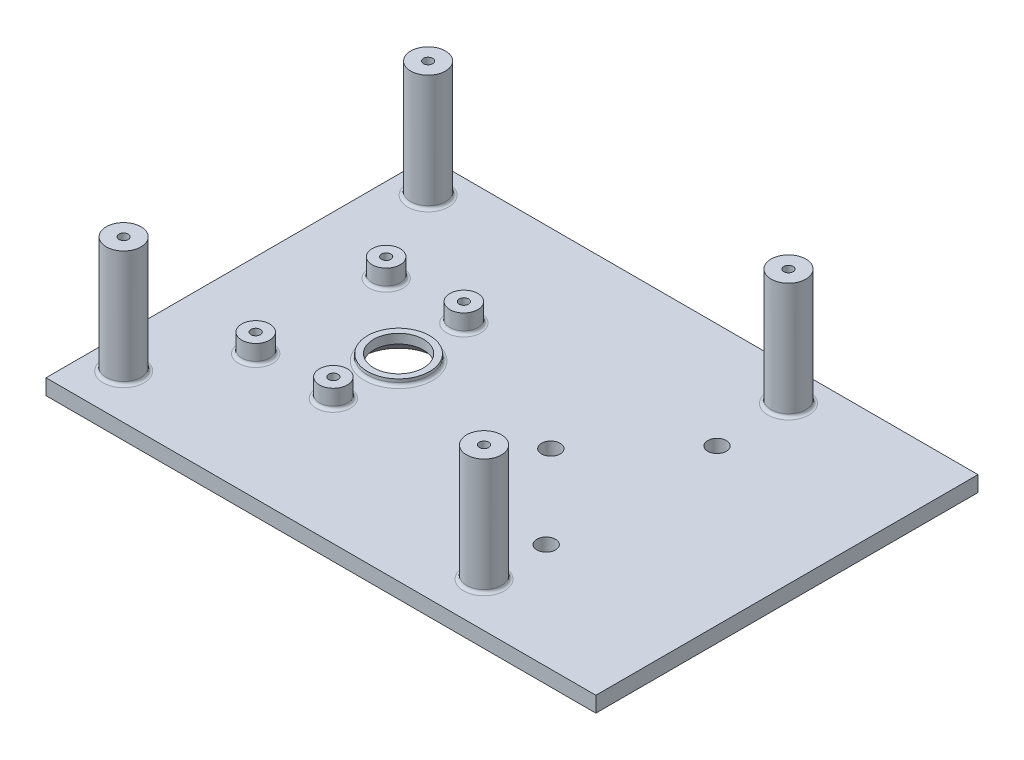
ISO-10303-21;
HEADER;
FILE_DESCRIPTION(('STEP AP214'),'2;1');
FILE_NAME('part.step','',(''),(''),'','','');
FILE_SCHEMA(('AUTOMOTIVE_DESIGN { 1 0 10303 214 1 1 1 1 }'));
ENDSEC;
DATA;
#1=APPLICATION_CONTEXT('core data for automotive mechanical design processes');
#2=APPLICATION_PROTOCOL_DEFINITION('international standard','automotive_design',2000,#1);
#3=PRODUCT_CONTEXT('',#1,'mechanical');
#4=PRODUCT('Part','Part','',(#3));
#5=PRODUCT_RELATED_PRODUCT_CATEGORY('part','',(#4));
#6=PRODUCT_DEFINITION_FORMATION('','',#4);
#7=PRODUCT_DEFINITION_CONTEXT('part definition',#1,'design');
#8=PRODUCT_DEFINITION('design','',#6,#7);
#9=PRODUCT_DEFINITION_SHAPE('','',#8);
#10=(LENGTH_UNIT() NAMED_UNIT(*) SI_UNIT(.MILLI.,.METRE.));
#11=(NAMED_UNIT(*) PLANE_ANGLE_UNIT() SI_UNIT($,.RADIAN.));
#12=(NAMED_UNIT(*) SI_UNIT($,.STERADIAN.) SOLID_ANGLE_UNIT());
#13=UNCERTAINTY_MEASURE_WITH_UNIT(LENGTH_MEASURE(1.E-05),#10,'distance_accuracy_value','');
#14=(GEOMETRIC_REPRESENTATION_CONTEXT(3) GLOBAL_UNCERTAINTY_ASSIGNED_CONTEXT((#13)) GLOBAL_UNIT_ASSIGNED_CONTEXT((#10,
#11,#12)) REPRESENTATION_CONTEXT('',''));
#15=CARTESIAN_POINT('',(0.,0.,0.));
#16=DIRECTION('',(0.,0.,1.));
#17=DIRECTION('',(1.,0.,0.));
#18=AXIS2_PLACEMENT_3D('',#15,#16,#17);
#19=CARTESIAN_POINT('',(-44.25,2.5,-61.5));
#20=DIRECTION('',(0.,0.,-1.));
#21=DIRECTION('',(-1.,0.,0.));
#22=AXIS2_PLACEMENT_3D('',#19,#20,#21);
#23=PLANE('',#22);
#24=DIRECTION('',(1.,0.,0.));
#25=VECTOR('',#24,1.);
#26=CARTESIAN_POINT('',(-44.25,0.,-61.5));
#27=LINE('',#26,#25);
#28=CARTESIAN_POINT('',(-44.25,0.,-61.5));
#29=VERTEX_POINT('',#28);
#30=CARTESIAN_POINT('',(44.25,0.,-61.5));
#31=VERTEX_POINT('',#30);
#32=EDGE_CURVE('E147',#29,#31,#27,.T.);
#33=ORIENTED_EDGE('',*,*,#32,.F.);
#34=DIRECTION('',(0.,-1.,0.));
#35=VECTOR('',#34,1.);
#36=CARTESIAN_POINT('',(-44.25,2.5,-61.5));
#37=LINE('',#36,#35);
#38=CARTESIAN_POINT('',(-44.25,2.5,-61.5));
#39=VERTEX_POINT('',#38);
#40=EDGE_CURVE('E89',#39,#29,#37,.T.);
#41=ORIENTED_EDGE('',*,*,#40,.F.);
#42=DIRECTION('',(1.,0.,0.));
#43=VECTOR('',#42,1.);
#44=CARTESIAN_POINT('',(-44.25,2.5,-61.5));
#45=LINE('',#44,#43);
#46=CARTESIAN_POINT('',(44.25,2.5,-61.5));
#47=VERTEX_POINT('',#46);
#48=EDGE_CURVE('E139',#39,#47,#45,.T.);
#49=ORIENTED_EDGE('',*,*,#48,.T.);
#50=DIRECTION('',(0.,-1.,0.));
#51=VECTOR('',#50,1.);
#52=CARTESIAN_POINT('',(44.25,2.5,-61.5));
#53=LINE('',#52,#51);
#54=EDGE_CURVE('E114',#47,#31,#53,.T.);
#55=ORIENTED_EDGE('',*,*,#54,.T.);
#56=EDGE_LOOP('',(#33,#41,#49,#55));
#57=FACE_BOUND('',#56,.T.);
#58=ADVANCED_FACE('F71',(#57),#23,.T.);
#59=CARTESIAN_POINT('',(-44.25,2.5,-61.5));
#60=DIRECTION('',(1.,0.,0.));
#61=DIRECTION('',(0.,0.,-1.));
#62=AXIS2_PLACEMENT_3D('',#59,#60,#61);
#63=PLANE('',#62);
#64=DIRECTION('',(0.,0.,1.));
#65=VECTOR('',#64,1.);
#66=CARTESIAN_POINT('',(-44.25,0.,-61.5));
#67=LINE('',#66,#65);
#68=CARTESIAN_POINT('',(-44.25,0.,0.));
#69=VERTEX_POINT('',#68);
#70=EDGE_CURVE('E106',#29,#69,#67,.T.);
#71=ORIENTED_EDGE('',*,*,#70,.T.);
#72=DIRECTION('',(0.,-1.,0.));
#73=VECTOR('',#72,1.);
#74=CARTESIAN_POINT('',(-44.25,2.5,0.));
#75=LINE('',#74,#73);
#76=CARTESIAN_POINT('',(-44.25,2.5,0.));
#77=VERTEX_POINT('',#76);
#78=EDGE_CURVE('E135',#77,#69,#75,.T.);
#79=ORIENTED_EDGE('',*,*,#78,.F.);
#80=DIRECTION('',(0.,0.,1.));
#81=VECTOR('',#80,1.);
#82=CARTESIAN_POINT('',(-44.25,2.5,-61.5));
#83=LINE('',#82,#81);
#84=EDGE_CURVE('E124',#39,#77,#83,.T.);
#85=ORIENTED_EDGE('',*,*,#84,.F.);
#86=ORIENTED_EDGE('',*,*,#40,.T.);
#87=EDGE_LOOP('',(#71,#79,#85,#86));
#88=FACE_BOUND('',#87,.T.);
#89=ADVANCED_FACE('F258',(#88),#63,.F.);
#90=CARTESIAN_POINT('',(-44.25,2.5,0.));
#91=DIRECTION('',(0.,0.,-1.));
#92=DIRECTION('',(-1.,0.,0.));
#93=AXIS2_PLACEMENT_3D('',#90,#91,#92);
#94=PLANE('',#93);
#95=DIRECTION('',(1.,0.,0.));
#96=VECTOR('',#95,1.);
#97=CARTESIAN_POINT('',(-44.25,0.,0.));
#98=LINE('',#97,#96);
#99=CARTESIAN_POINT('',(44.25,0.,0.));
#100=VERTEX_POINT('',#99);
#101=EDGE_CURVE('E132',#69,#100,#98,.T.);
#102=ORIENTED_EDGE('',*,*,#101,.T.);
#103=DIRECTION('',(0.,-1.,0.));
#104=VECTOR('',#103,1.);
#105=CARTESIAN_POINT('',(44.25,2.5,0.));
#106=LINE('',#105,#104);
#107=CARTESIAN_POINT('',(44.25,2.5,0.));
#108=VERTEX_POINT('',#107);
#109=EDGE_CURVE('E129',#108,#100,#106,.T.);
#110=ORIENTED_EDGE('',*,*,#109,.F.);
#111=DIRECTION('',(1.,0.,0.));
#112=VECTOR('',#111,1.);
#113=CARTESIAN_POINT('',(-44.25,2.5,0.));
#114=LINE('',#113,#112);
#115=EDGE_CURVE('E119',#77,#108,#114,.T.);
#116=ORIENTED_EDGE('',*,*,#115,.F.);
#117=ORIENTED_EDGE('',*,*,#78,.T.);
#118=EDGE_LOOP('',(#102,#110,#116,#117));
#119=FACE_BOUND('',#118,.T.);
#120=ADVANCED_FACE('F130',(#119),#94,.F.);
#121=CARTESIAN_POINT('',(44.25,2.5,-61.5));
#122=DIRECTION('',(1.,0.,0.));
#123=DIRECTION('',(0.,0.,-1.));
#124=AXIS2_PLACEMENT_3D('',#121,#122,#123);
#125=PLANE('',#124);
#126=DIRECTION('',(0.,0.,1.));
#127=VECTOR('',#126,1.);
#128=CARTESIAN_POINT('',(44.25,0.,-61.5));
#129=LINE('',#128,#127);
#130=EDGE_CURVE('E151',#31,#100,#129,.T.);
#131=ORIENTED_EDGE('',*,*,#130,.F.);
#132=ORIENTED_EDGE('',*,*,#54,.F.);
#133=DIRECTION('',(0.,0.,1.));
#134=VECTOR('',#133,1.);
#135=CARTESIAN_POINT('',(44.25,2.5,-61.5));
#136=LINE('',#135,#134);
#137=EDGE_CURVE('E123',#47,#108,#136,.T.);
#138=ORIENTED_EDGE('',*,*,#137,.T.);
#139=ORIENTED_EDGE('',*,*,#109,.T.);
#140=EDGE_LOOP('',(#131,#132,#138,#139));
#141=FACE_BOUND('',#140,.T.);
#142=ADVANCED_FACE('F137',(#141),#125,.T.);
#143=CARTESIAN_POINT('',(0.,2.5,0.));
#144=DIRECTION('',(0.,-1.,0.));
#145=DIRECTION('',(0.,0.,-1.));
#146=AXIS2_PLACEMENT_3D('',#143,#144,#145);
#147=PLANE('',#146);
#148=CARTESIAN_POINT('',(19.25,2.5,-44.5));
#149=DIRECTION('',(0.,-1.,0.));
#150=DIRECTION('',(0.,0.,-1.));
#151=AXIS2_PLACEMENT_3D('',#148,#149,#150);
#152=CIRCLE('',#151,1.49999999999999);
#153=CARTESIAN_POINT('',(19.25,2.5,-46.));
#154=VERTEX_POINT('',#153);
#155=EDGE_CURVE('E429',#154,#154,#152,.T.);
#156=ORIENTED_EDGE('',*,*,#155,.T.);
#157=EDGE_LOOP('',(#156));
#158=FACE_BOUND('',#157,.T.);
#159=CARTESIAN_POINT('',(19.25,2.5,-17.));
#160=DIRECTION('',(0.,-1.,0.));
#161=DIRECTION('',(0.,0.,-1.));
#162=AXIS2_PLACEMENT_3D('',#159,#160,#161);
#163=CIRCLE('',#162,1.49999999999999);
#164=CARTESIAN_POINT('',(19.25,2.5,-18.5));
#165=VERTEX_POINT('',#164);
#166=EDGE_CURVE('E421',#165,#165,#163,.T.);
#167=ORIENTED_EDGE('',*,*,#166,.T.);
#168=EDGE_LOOP('',(#167));
#169=FACE_BOUND('',#168,.T.);
#170=CARTESIAN_POINT('',(6.24999999999999,2.5,-30.75));
#171=DIRECTION('',(0.,-1.,0.));
#172=DIRECTION('',(0.,0.,-1.));
#173=AXIS2_PLACEMENT_3D('',#170,#171,#172);
#174=CIRCLE('',#173,1.49999999999999);
#175=CARTESIAN_POINT('',(6.24999999999999,2.5,-32.25));
#176=VERTEX_POINT('',#175);
#177=EDGE_CURVE('E410',#176,#176,#174,.T.);
#178=ORIENTED_EDGE('',*,*,#177,.T.);
#179=EDGE_LOOP('',(#178));
#180=FACE_BOUND('',#179,.T.);
#181=CARTESIAN_POINT('',(-30.75,2.5,-41.25));
#182=DIRECTION('',(0.,-1.,0.));
#183=DIRECTION('',(0.,0.,-1.));
#184=AXIS2_PLACEMENT_3D('',#181,#182,#183);
#185=CIRCLE('',#184,2.75);
#186=CARTESIAN_POINT('',(-30.75,2.5,-44.));
#187=VERTEX_POINT('',#186);
#188=EDGE_CURVE('E209',#187,#187,#185,.T.);
#189=ORIENTED_EDGE('',*,*,#188,.T.);
#190=EDGE_LOOP('',(#189));
#191=FACE_BOUND('',#190,.T.);
#192=CARTESIAN_POINT('',(-18.25,2.5,-30.75));
#193=DIRECTION('',(0.,-1.,0.));
#194=DIRECTION('',(0.,0.,-1.));
#195=AXIS2_PLACEMENT_3D('',#192,#193,#194);
#196=CIRCLE('',#195,5.5);
#197=CARTESIAN_POINT('',(-18.25,2.5,-36.25));
#198=VERTEX_POINT('',#197);
#199=EDGE_CURVE('E205',#198,#198,#196,.T.);
#200=ORIENTED_EDGE('',*,*,#199,.T.);
#201=EDGE_LOOP('',(#200));
#202=FACE_BOUND('',#201,.T.);
#203=CARTESIAN_POINT('',(-30.75,2.5,-20.25));
#204=DIRECTION('',(0.,-1.,0.));
#205=DIRECTION('',(0.,0.,-1.));
#206=AXIS2_PLACEMENT_3D('',#203,#204,#205);
#207=CIRCLE('',#206,2.75);
#208=CARTESIAN_POINT('',(-30.75,2.5,-23.));
#209=VERTEX_POINT('',#208);
#210=EDGE_CURVE('E201',#209,#209,#207,.T.);
#211=ORIENTED_EDGE('',*,*,#210,.T.);
#212=EDGE_LOOP('',(#211));
#213=FACE_BOUND('',#212,.T.);
#214=CARTESIAN_POINT('',(-18.25,2.5,-20.25));
#215=DIRECTION('',(0.,-1.,0.));
#216=DIRECTION('',(0.,0.,-1.));
#217=AXIS2_PLACEMENT_3D('',#214,#215,#216);
#218=CIRCLE('',#217,2.75);
#219=CARTESIAN_POINT('',(-18.25,2.5,-23.));
#220=VERTEX_POINT('',#219);
#221=EDGE_CURVE('E197',#220,#220,#218,.T.);
#222=ORIENTED_EDGE('',*,*,#221,.T.);
#223=EDGE_LOOP('',(#222));
#224=FACE_BOUND('',#223,.T.);
#225=CARTESIAN_POINT('',(-18.25,2.5,-41.25));
#226=DIRECTION('',(0.,-1.,0.));
#227=DIRECTION('',(0.,0.,-1.));
#228=AXIS2_PLACEMENT_3D('',#225,#226,#227);
#229=CIRCLE('',#228,2.75);
#230=CARTESIAN_POINT('',(-18.25,2.5,-44.));
#231=VERTEX_POINT('',#230);
#232=EDGE_CURVE('E193',#231,#231,#229,.T.);
#233=ORIENTED_EDGE('',*,*,#232,.T.);
#234=EDGE_LOOP('',(#233));
#235=FACE_BOUND('',#234,.T.);
#236=CARTESIAN_POINT('',(-38.95,2.5,-7.19999999999997));
#237=DIRECTION('',(0.,-1.,0.));
#238=DIRECTION('',(0.,0.,-1.));
#239=AXIS2_PLACEMENT_3D('',#236,#237,#238);
#240=CIRCLE('',#239,3.3);
#241=CARTESIAN_POINT('',(-38.95,2.5,-10.5));
#242=VERTEX_POINT('',#241);
#243=EDGE_CURVE('E189',#242,#242,#240,.T.);
#244=ORIENTED_EDGE('',*,*,#243,.T.);
#245=EDGE_LOOP('',(#244));
#246=FACE_BOUND('',#245,.T.);
#247=CARTESIAN_POINT('',(-38.95,2.5,-56.2));
#248=DIRECTION('',(0.,-1.,0.));
#249=DIRECTION('',(0.,0.,-1.));
#250=AXIS2_PLACEMENT_3D('',#247,#248,#249);
#251=CIRCLE('',#250,3.3);
#252=CARTESIAN_POINT('',(-38.95,2.5,-59.5));
#253=VERTEX_POINT('',#252);
#254=EDGE_CURVE('E185',#253,#253,#251,.T.);
#255=ORIENTED_EDGE('',*,*,#254,.T.);
#256=EDGE_LOOP('',(#255));
#257=FACE_BOUND('',#256,.T.);
#258=CARTESIAN_POINT('',(19.05,2.5,-7.19999999999997));
#259=DIRECTION('',(0.,-1.,0.));
#260=DIRECTION('',(0.,0.,-1.));
#261=AXIS2_PLACEMENT_3D('',#258,#259,#260);
#262=CIRCLE('',#261,3.3);
#263=CARTESIAN_POINT('',(19.05,2.5,-10.5));
#264=VERTEX_POINT('',#263);
#265=EDGE_CURVE('E181',#264,#264,#262,.T.);
#266=ORIENTED_EDGE('',*,*,#265,.T.);
#267=EDGE_LOOP('',(#266));
#268=FACE_BOUND('',#267,.T.);
#269=CARTESIAN_POINT('',(19.05,2.5,-56.2));
#270=DIRECTION('',(0.,-1.,0.));
#271=DIRECTION('',(0.,0.,-1.));
#272=AXIS2_PLACEMENT_3D('',#269,#270,#271);
#273=CIRCLE('',#272,3.3);
#274=CARTESIAN_POINT('',(19.05,2.5,-59.5));
#275=VERTEX_POINT('',#274);
#276=EDGE_CURVE('E177',#275,#275,#273,.T.);
#277=ORIENTED_EDGE('',*,*,#276,.T.);
#278=EDGE_LOOP('',(#277));
#279=FACE_BOUND('',#278,.T.);
#280=ORIENTED_EDGE('',*,*,#48,.F.);
#281=ORIENTED_EDGE('',*,*,#84,.T.);
#282=ORIENTED_EDGE('',*,*,#115,.T.);
#283=ORIENTED_EDGE('',*,*,#137,.F.);
#284=EDGE_LOOP('',(#280,#281,#282,#283));
#285=FACE_BOUND('',#284,.T.);
#286=ADVANCED_FACE('F122',(#158,#169,#180,#191,#202,#213,#224,#235,#246,#257,#268,#279,#285),
#147,.F.);
#287=CARTESIAN_POINT('',(0.,0.,0.));
#288=DIRECTION('',(0.,-1.,0.));
#289=DIRECTION('',(0.,0.,-1.));
#290=AXIS2_PLACEMENT_3D('',#287,#288,#289);
#291=PLANE('',#290);
#292=CARTESIAN_POINT('',(19.25,0.,-44.5));
#293=DIRECTION('',(0.,-1.,0.));
#294=DIRECTION('',(0.,0.,-1.));
#295=AXIS2_PLACEMENT_3D('',#292,#293,#294);
#296=CIRCLE('',#295,1.49999999999999);
#297=CARTESIAN_POINT('',(19.25,0.,-46.));
#298=VERTEX_POINT('',#297);
#299=EDGE_CURVE('E433',#298,#298,#296,.T.);
#300=ORIENTED_EDGE('',*,*,#299,.F.);
#301=EDGE_LOOP('',(#300));
#302=FACE_BOUND('',#301,.T.);
#303=CARTESIAN_POINT('',(19.25,0.,-17.));
#304=DIRECTION('',(0.,-1.,0.));
#305=DIRECTION('',(0.,0.,-1.));
#306=AXIS2_PLACEMENT_3D('',#303,#304,#305);
#307=CIRCLE('',#306,1.49999999999999);
#308=CARTESIAN_POINT('',(19.25,0.,-18.5));
#309=VERTEX_POINT('',#308);
#310=EDGE_CURVE('E425',#309,#309,#307,.T.);
#311=ORIENTED_EDGE('',*,*,#310,.F.);
#312=EDGE_LOOP('',(#311));
#313=FACE_BOUND('',#312,.T.);
#314=CARTESIAN_POINT('',(6.24999999999999,0.,-30.75));
#315=DIRECTION('',(0.,-1.,0.));
#316=DIRECTION('',(0.,0.,-1.));
#317=AXIS2_PLACEMENT_3D('',#314,#315,#316);
#318=CIRCLE('',#317,1.49999999999999);
#319=CARTESIAN_POINT('',(6.24999999999999,0.,-32.25));
#320=VERTEX_POINT('',#319);
#321=EDGE_CURVE('E417',#320,#320,#318,.T.);
#322=ORIENTED_EDGE('',*,*,#321,.F.);
#323=EDGE_LOOP('',(#322));
#324=FACE_BOUND('',#323,.T.);
#325=CARTESIAN_POINT('',(-18.25,0.,-30.75));
#326=DIRECTION('',(0.,-1.,0.));
#327=DIRECTION('',(0.,0.,-1.));
#328=AXIS2_PLACEMENT_3D('',#325,#326,#327);
#329=CIRCLE('',#328,6.00000000000001);
#330=CARTESIAN_POINT('',(-18.25,0.,-36.75));
#331=VERTEX_POINT('',#330);
#332=EDGE_CURVE('E169',#331,#331,#329,.F.);
#333=ORIENTED_EDGE('',*,*,#332,.T.);
#334=EDGE_LOOP('',(#333));
#335=FACE_BOUND('',#334,.T.);
#336=ORIENTED_EDGE('',*,*,#32,.T.);
#337=ORIENTED_EDGE('',*,*,#130,.T.);
#338=ORIENTED_EDGE('',*,*,#101,.F.);
#339=ORIENTED_EDGE('',*,*,#70,.F.);
#340=EDGE_LOOP('',(#336,#337,#338,#339));
#341=FACE_BOUND('',#340,.T.);
#342=ADVANCED_FACE('F306',(#302,#313,#324,#335,#341),#291,.T.);
#343=CARTESIAN_POINT('',(-38.95,21.2,-7.19999999999997));
#344=DIRECTION('',(0.,-1.,0.));
#345=DIRECTION('',(0.,0.,-1.));
#346=AXIS2_PLACEMENT_3D('',#343,#344,#345);
#347=CYLINDRICAL_SURFACE('',#346,2.8);
#348=CARTESIAN_POINT('',(-38.95,3.,-7.19999999999997));
#349=DIRECTION('',(0.,-1.,0.));
#350=DIRECTION('',(0.,0.,-1.));
#351=AXIS2_PLACEMENT_3D('',#348,#349,#350);
#352=CIRCLE('',#351,2.8);
#353=CARTESIAN_POINT('',(-38.95,3.,-9.99999999999997));
#354=VERTEX_POINT('',#353);
#355=EDGE_CURVE('E229',#354,#354,#352,.F.);
#356=ORIENTED_EDGE('',*,*,#355,.T.);
#357=EDGE_LOOP('',(#356));
#358=FACE_BOUND('',#357,.T.);
#359=CARTESIAN_POINT('',(-38.95,21.2,-7.19999999999997));
#360=DIRECTION('',(0.,1.,0.));
#361=DIRECTION('',(0.,0.,1.));
#362=AXIS2_PLACEMENT_3D('',#359,#360,#361);
#363=CIRCLE('',#362,2.8);
#364=CARTESIAN_POINT('',(-38.95,21.2,-4.39999999999997));
#365=VERTEX_POINT('',#364);
#366=EDGE_CURVE('E152',#365,#365,#363,.T.);
#367=ORIENTED_EDGE('',*,*,#366,.F.);
#368=EDGE_LOOP('',(#367));
#369=FACE_BOUND('',#368,.T.);
#370=ADVANCED_FACE('F302',(#358,#369),#347,.T.);
#371=CARTESIAN_POINT('',(-38.95,21.2,-7.19999999999997));
#372=DIRECTION('',(0.,1.,0.));
#373=DIRECTION('',(0.,0.,1.));
#374=AXIS2_PLACEMENT_3D('',#371,#372,#373);
#375=PLANE('',#374);
#376=CARTESIAN_POINT('',(-38.95,21.2,-7.19999999999997));
#377=DIRECTION('',(0.,1.,0.));
#378=DIRECTION('',(0.,0.,1.));
#379=AXIS2_PLACEMENT_3D('',#376,#377,#378);
#380=CIRCLE('',#379,0.749999999999999);
#381=CARTESIAN_POINT('',(-38.95,21.2,-6.44999999999997));
#382=VERTEX_POINT('',#381);
#383=EDGE_CURVE('E390',#382,#382,#380,.T.);
#384=ORIENTED_EDGE('',*,*,#383,.F.);
#385=EDGE_LOOP('',(#384));
#386=FACE_BOUND('',#385,.T.);
#387=ORIENTED_EDGE('',*,*,#366,.T.);
#388=EDGE_LOOP('',(#387));
#389=FACE_BOUND('',#388,.T.);
#390=ADVANCED_FACE('F305',(#386,#389),#375,.T.);
#391=CARTESIAN_POINT('',(-38.95,21.2,-56.2));
#392=DIRECTION('',(0.,-1.,0.));
#393=DIRECTION('',(0.,0.,-1.));
#394=AXIS2_PLACEMENT_3D('',#391,#392,#393);
#395=CYLINDRICAL_SURFACE('',#394,2.8);
#396=CARTESIAN_POINT('',(-38.95,3.,-56.2));
#397=DIRECTION('',(0.,-1.,0.));
#398=DIRECTION('',(0.,0.,-1.));
#399=AXIS2_PLACEMENT_3D('',#396,#397,#398);
#400=CIRCLE('',#399,2.8);
#401=CARTESIAN_POINT('',(-38.95,3.,-59.));
#402=VERTEX_POINT('',#401);
#403=EDGE_CURVE('E233',#402,#402,#400,.F.);
#404=ORIENTED_EDGE('',*,*,#403,.T.);
#405=EDGE_LOOP('',(#404));
#406=FACE_BOUND('',#405,.T.);
#407=CARTESIAN_POINT('',(-38.95,21.2,-56.2));
#408=DIRECTION('',(0.,1.,0.));
#409=DIRECTION('',(0.,0.,1.));
#410=AXIS2_PLACEMENT_3D('',#407,#408,#409);
#411=CIRCLE('',#410,2.8);
#412=CARTESIAN_POINT('',(-38.95,21.2,-53.4));
#413=VERTEX_POINT('',#412);
#414=EDGE_CURVE('E312',#413,#413,#411,.T.);
#415=ORIENTED_EDGE('',*,*,#414,.F.);
#416=EDGE_LOOP('',(#415));
#417=FACE_BOUND('',#416,.T.);
#418=ADVANCED_FACE('F486',(#406,#417),#395,.T.);
#419=CARTESIAN_POINT('',(-38.95,21.2,-56.2));
#420=DIRECTION('',(0.,1.,0.));
#421=DIRECTION('',(0.,0.,1.));
#422=AXIS2_PLACEMENT_3D('',#419,#420,#421);
#423=PLANE('',#422);
#424=CARTESIAN_POINT('',(-38.95,21.2,-56.2));
#425=DIRECTION('',(0.,1.,0.));
#426=DIRECTION('',(0.,0.,1.));
#427=AXIS2_PLACEMENT_3D('',#424,#425,#426);
#428=CIRCLE('',#427,0.749999999999999);
#429=CARTESIAN_POINT('',(-38.95,21.2,-55.45));
#430=VERTEX_POINT('',#429);
#431=EDGE_CURVE('E382',#430,#430,#428,.T.);
#432=ORIENTED_EDGE('',*,*,#431,.F.);
#433=EDGE_LOOP('',(#432));
#434=FACE_BOUND('',#433,.T.);
#435=ORIENTED_EDGE('',*,*,#414,.T.);
#436=EDGE_LOOP('',(#435));
#437=FACE_BOUND('',#436,.T.);
#438=ADVANCED_FACE('F481',(#434,#437),#423,.T.);
#439=CARTESIAN_POINT('',(19.05,21.2,-56.2));
#440=DIRECTION('',(0.,-1.,0.));
#441=DIRECTION('',(0.,0.,-1.));
#442=AXIS2_PLACEMENT_3D('',#439,#440,#441);
#443=CYLINDRICAL_SURFACE('',#442,2.8);
#444=CARTESIAN_POINT('',(19.05,3.,-56.2));
#445=DIRECTION('',(0.,-1.,0.));
#446=DIRECTION('',(0.,0.,-1.));
#447=AXIS2_PLACEMENT_3D('',#444,#445,#446);
#448=CIRCLE('',#447,2.8);
#449=CARTESIAN_POINT('',(19.05,3.,-59.));
#450=VERTEX_POINT('',#449);
#451=EDGE_CURVE('E12',#450,#450,#448,.F.);
#452=ORIENTED_EDGE('',*,*,#451,.T.);
#453=EDGE_LOOP('',(#452));
#454=FACE_BOUND('',#453,.T.);
#455=CARTESIAN_POINT('',(19.05,21.2,-56.2));
#456=DIRECTION('',(0.,1.,0.));
#457=DIRECTION('',(0.,0.,1.));
#458=AXIS2_PLACEMENT_3D('',#455,#456,#457);
#459=CIRCLE('',#458,2.8);
#460=CARTESIAN_POINT('',(19.05,21.2,-53.4));
#461=VERTEX_POINT('',#460);
#462=EDGE_CURVE('E315',#461,#461,#459,.T.);
#463=ORIENTED_EDGE('',*,*,#462,.F.);
#464=EDGE_LOOP('',(#463));
#465=FACE_BOUND('',#464,.T.);
#466=ADVANCED_FACE('F478',(#454,#465),#443,.T.);
#467=CARTESIAN_POINT('',(19.05,21.2,-56.2));
#468=DIRECTION('',(0.,1.,0.));
#469=DIRECTION('',(0.,0.,1.));
#470=AXIS2_PLACEMENT_3D('',#467,#468,#469);
#471=PLANE('',#470);
#472=CARTESIAN_POINT('',(19.05,21.2,-56.2));
#473=DIRECTION('',(0.,1.,0.));
#474=DIRECTION('',(0.,0.,1.));
#475=AXIS2_PLACEMENT_3D('',#472,#473,#474);
#476=CIRCLE('',#475,0.750000000000002);
#477=CARTESIAN_POINT('',(19.05,21.2,-55.45));
#478=VERTEX_POINT('',#477);
#479=EDGE_CURVE('E399',#478,#478,#476,.T.);
#480=ORIENTED_EDGE('',*,*,#479,.F.);
#481=EDGE_LOOP('',(#480));
#482=FACE_BOUND('',#481,.T.);
#483=ORIENTED_EDGE('',*,*,#462,.T.);
#484=EDGE_LOOP('',(#483));
#485=FACE_BOUND('',#484,.T.);
#486=ADVANCED_FACE('F476',(#482,#485),#471,.T.);
#487=CARTESIAN_POINT('',(19.05,21.2,-7.19999999999997));
#488=DIRECTION('',(0.,-1.,0.));
#489=DIRECTION('',(0.,0.,-1.));
#490=AXIS2_PLACEMENT_3D('',#487,#488,#489);
#491=CYLINDRICAL_SURFACE('',#490,2.8);
#492=CARTESIAN_POINT('',(19.05,3.,-7.19999999999997));
#493=DIRECTION('',(0.,-1.,0.));
#494=DIRECTION('',(0.,0.,-1.));
#495=AXIS2_PLACEMENT_3D('',#492,#493,#494);
#496=CIRCLE('',#495,2.8);
#497=CARTESIAN_POINT('',(19.05,3.,-9.99999999999997));
#498=VERTEX_POINT('',#497);
#499=EDGE_CURVE('E81',#498,#498,#496,.F.);
#500=ORIENTED_EDGE('',*,*,#499,.T.);
#501=EDGE_LOOP('',(#500));
#502=FACE_BOUND('',#501,.T.);
#503=CARTESIAN_POINT('',(19.05,21.2,-7.19999999999997));
#504=DIRECTION('',(0.,1.,0.));
#505=DIRECTION('',(0.,0.,1.));
#506=AXIS2_PLACEMENT_3D('',#503,#504,#505);
#507=CIRCLE('',#506,2.8);
#508=CARTESIAN_POINT('',(19.05,21.2,-4.39999999999997));
#509=VERTEX_POINT('',#508);
#510=EDGE_CURVE('E321',#509,#509,#507,.T.);
#511=ORIENTED_EDGE('',*,*,#510,.F.);
#512=EDGE_LOOP('',(#511));
#513=FACE_BOUND('',#512,.T.);
#514=ADVANCED_FACE('F240',(#502,#513),#491,.T.);
#515=CARTESIAN_POINT('',(19.05,21.2,-7.19999999999997));
#516=DIRECTION('',(0.,1.,0.));
#517=DIRECTION('',(0.,0.,1.));
#518=AXIS2_PLACEMENT_3D('',#515,#516,#517);
#519=PLANE('',#518);
#520=CARTESIAN_POINT('',(19.05,21.2,-7.19999999999997));
#521=DIRECTION('',(0.,1.,0.));
#522=DIRECTION('',(0.,0.,1.));
#523=AXIS2_PLACEMENT_3D('',#520,#521,#522);
#524=CIRCLE('',#523,0.750000000000002);
#525=CARTESIAN_POINT('',(19.05,21.2,-6.44999999999997));
#526=VERTEX_POINT('',#525);
#527=EDGE_CURVE('E406',#526,#526,#524,.T.);
#528=ORIENTED_EDGE('',*,*,#527,.F.);
#529=EDGE_LOOP('',(#528));
#530=FACE_BOUND('',#529,.T.);
#531=ORIENTED_EDGE('',*,*,#510,.T.);
#532=EDGE_LOOP('',(#531));
#533=FACE_BOUND('',#532,.T.);
#534=ADVANCED_FACE('F462',(#530,#533),#519,.T.);
#535=CARTESIAN_POINT('',(-18.25,3.5,-30.75));
#536=DIRECTION('',(0.,1.,0.));
#537=DIRECTION('',(0.,0.,1.));
#538=AXIS2_PLACEMENT_3D('',#535,#536,#537);
#539=PLANE('',#538);
#540=CARTESIAN_POINT('',(-18.25,3.5,-30.75));
#541=DIRECTION('',(0.,1.,0.));
#542=DIRECTION('',(0.,0.,1.));
#543=AXIS2_PLACEMENT_3D('',#540,#541,#542);
#544=CIRCLE('',#543,5.);
#545=CARTESIAN_POINT('',(-18.25,3.5,-25.75));
#546=VERTEX_POINT('',#545);
#547=EDGE_CURVE('E325',#546,#546,#544,.T.);
#548=ORIENTED_EDGE('',*,*,#547,.T.);
#549=EDGE_LOOP('',(#548));
#550=FACE_BOUND('',#549,.T.);
#551=CARTESIAN_POINT('',(-18.25,3.5,-30.75));
#552=DIRECTION('',(0.,1.,0.));
#553=DIRECTION('',(0.,0.,1.));
#554=AXIS2_PLACEMENT_3D('',#551,#552,#553);
#555=CIRCLE('',#554,4.);
#556=CARTESIAN_POINT('',(-18.25,3.5,-26.75));
#557=VERTEX_POINT('',#556);
#558=EDGE_CURVE('E329',#557,#557,#555,.T.);
#559=ORIENTED_EDGE('',*,*,#558,.F.);
#560=EDGE_LOOP('',(#559));
#561=FACE_BOUND('',#560,.T.);
#562=ADVANCED_FACE('F460',(#550,#561),#539,.T.);
#563=CARTESIAN_POINT('',(-18.25,3.5,-30.75));
#564=DIRECTION('',(0.,-1.,0.));
#565=DIRECTION('',(0.,0.,-1.));
#566=AXIS2_PLACEMENT_3D('',#563,#564,#565);
#567=CYLINDRICAL_SURFACE('',#566,5.);
#568=CARTESIAN_POINT('',(-18.25,3.,-30.75));
#569=DIRECTION('',(0.,-1.,0.));
#570=DIRECTION('',(0.,0.,-1.));
#571=AXIS2_PLACEMENT_3D('',#568,#569,#570);
#572=CIRCLE('',#571,5.);
#573=CARTESIAN_POINT('',(-18.25,3.,-35.75));
#574=VERTEX_POINT('',#573);
#575=EDGE_CURVE('E213',#574,#574,#572,.F.);
#576=ORIENTED_EDGE('',*,*,#575,.T.);
#577=EDGE_LOOP('',(#576));
#578=FACE_BOUND('',#577,.T.);
#579=ORIENTED_EDGE('',*,*,#547,.F.);
#580=EDGE_LOOP('',(#579));
#581=FACE_BOUND('',#580,.T.);
#582=ADVANCED_FACE('F456',(#578,#581),#567,.T.);
#583=CARTESIAN_POINT('',(-18.25,3.5,-30.75));
#584=DIRECTION('',(0.,-1.,0.));
#585=DIRECTION('',(0.,0.,-1.));
#586=AXIS2_PLACEMENT_3D('',#583,#584,#585);
#587=CYLINDRICAL_SURFACE('',#586,4.);
#588=CARTESIAN_POINT('',(-18.25,2.,-30.75));
#589=DIRECTION('',(0.,-1.,0.));
#590=DIRECTION('',(0.,0.,-1.));
#591=AXIS2_PLACEMENT_3D('',#588,#589,#590);
#592=CIRCLE('',#591,4.);
#593=CARTESIAN_POINT('',(-18.25,2.,-34.75));
#594=VERTEX_POINT('',#593);
#595=EDGE_CURVE('E161',#594,#594,#592,.T.);
#596=ORIENTED_EDGE('',*,*,#595,.T.);
#597=EDGE_LOOP('',(#596));
#598=FACE_BOUND('',#597,.T.);
#599=ORIENTED_EDGE('',*,*,#558,.T.);
#600=EDGE_LOOP('',(#599));
#601=FACE_BOUND('',#600,.T.);
#602=ADVANCED_FACE('F452',(#598,#601),#587,.F.);
#603=CARTESIAN_POINT('',(-18.25,5.5,-20.25));
#604=DIRECTION('',(0.,1.,0.));
#605=DIRECTION('',(0.,0.,1.));
#606=AXIS2_PLACEMENT_3D('',#603,#604,#605);
#607=PLANE('',#606);
#608=CARTESIAN_POINT('',(-18.25,5.5,-20.25));
#609=DIRECTION('',(0.,1.,0.));
#610=DIRECTION('',(0.,0.,1.));
#611=AXIS2_PLACEMENT_3D('',#608,#609,#610);
#612=CIRCLE('',#611,2.25);
#613=CARTESIAN_POINT('',(-18.25,5.5,-18.));
#614=VERTEX_POINT('',#613);
#615=EDGE_CURVE('E333',#614,#614,#612,.T.);
#616=ORIENTED_EDGE('',*,*,#615,.T.);
#617=EDGE_LOOP('',(#616));
#618=FACE_BOUND('',#617,.T.);
#619=CARTESIAN_POINT('',(-18.25,5.5,-20.25));
#620=DIRECTION('',(0.,1.,0.));
#621=DIRECTION('',(0.,0.,1.));
#622=AXIS2_PLACEMENT_3D('',#619,#620,#621);
#623=CIRCLE('',#622,0.750000000000002);
#624=CARTESIAN_POINT('',(-18.25,5.5,-19.5));
#625=VERTEX_POINT('',#624);
#626=EDGE_CURVE('E337',#625,#625,#623,.T.);
#627=ORIENTED_EDGE('',*,*,#626,.F.);
#628=EDGE_LOOP('',(#627));
#629=FACE_BOUND('',#628,.T.);
#630=ADVANCED_FACE('F455',(#618,#629),#607,.T.);
#631=CARTESIAN_POINT('',(-18.25,5.5,-20.25));
#632=DIRECTION('',(0.,-1.,0.));
#633=DIRECTION('',(0.,0.,-1.));
#634=AXIS2_PLACEMENT_3D('',#631,#632,#633);
#635=CYLINDRICAL_SURFACE('',#634,2.25);
#636=CARTESIAN_POINT('',(-18.25,3.,-20.25));
#637=DIRECTION('',(0.,-1.,0.));
#638=DIRECTION('',(0.,0.,-1.));
#639=AXIS2_PLACEMENT_3D('',#636,#637,#638);
#640=CIRCLE('',#639,2.25);
#641=CARTESIAN_POINT('',(-18.25,3.,-22.5));
#642=VERTEX_POINT('',#641);
#643=EDGE_CURVE('E221',#642,#642,#640,.F.);
#644=ORIENTED_EDGE('',*,*,#643,.T.);
#645=EDGE_LOOP('',(#644));
#646=FACE_BOUND('',#645,.T.);
#647=ORIENTED_EDGE('',*,*,#615,.F.);
#648=EDGE_LOOP('',(#647));
#649=FACE_BOUND('',#648,.T.);
#650=ADVANCED_FACE('F749',(#646,#649),#635,.T.);
#651=CARTESIAN_POINT('',(-18.25,5.5,-20.25));
#652=DIRECTION('',(0.,-1.,0.));
#653=DIRECTION('',(0.,0.,-1.));
#654=AXIS2_PLACEMENT_3D('',#651,#652,#653);
#655=CYLINDRICAL_SURFACE('',#654,0.750000000000002);
#656=ORIENTED_EDGE('',*,*,#626,.T.);
#657=EDGE_LOOP('',(#656));
#658=FACE_BOUND('',#657,.T.);
#659=CARTESIAN_POINT('',(-18.25,2.5,-20.25));
#660=DIRECTION('',(0.,1.,0.));
#661=DIRECTION('',(0.,0.,1.));
#662=AXIS2_PLACEMENT_3D('',#659,#660,#661);
#663=CIRCLE('',#662,0.750000000000002);
#664=CARTESIAN_POINT('',(-18.25,2.5,-19.5));
#665=VERTEX_POINT('',#664);
#666=EDGE_CURVE('E338',#665,#665,#663,.T.);
#667=ORIENTED_EDGE('',*,*,#666,.F.);
#668=EDGE_LOOP('',(#667));
#669=FACE_BOUND('',#668,.T.);
#670=ADVANCED_FACE('F746',(#658,#669),#655,.F.);
#671=ORIENTED_EDGE('',*,*,#666,.T.);
#672=EDGE_LOOP('',(#671));
#673=FACE_BOUND('',#672,.T.);
#674=ADVANCED_FACE('F498',(#673),#147,.F.);
#675=CARTESIAN_POINT('',(-30.75,5.5,-41.25));
#676=DIRECTION('',(0.,1.,0.));
#677=DIRECTION('',(0.,0.,1.));
#678=AXIS2_PLACEMENT_3D('',#675,#676,#677);
#679=PLANE('',#678);
#680=CARTESIAN_POINT('',(-30.75,5.5,-41.25));
#681=DIRECTION('',(0.,1.,0.));
#682=DIRECTION('',(0.,0.,1.));
#683=AXIS2_PLACEMENT_3D('',#680,#681,#682);
#684=CIRCLE('',#683,2.25);
#685=CARTESIAN_POINT('',(-30.75,5.5,-39.));
#686=VERTEX_POINT('',#685);
#687=EDGE_CURVE('E350',#686,#686,#684,.T.);
#688=ORIENTED_EDGE('',*,*,#687,.T.);
#689=EDGE_LOOP('',(#688));
#690=FACE_BOUND('',#689,.T.);
#691=CARTESIAN_POINT('',(-30.75,5.5,-41.25));
#692=DIRECTION('',(0.,1.,0.));
#693=DIRECTION('',(0.,0.,1.));
#694=AXIS2_PLACEMENT_3D('',#691,#692,#693);
#695=CIRCLE('',#694,0.750000000000002);
#696=CARTESIAN_POINT('',(-30.75,5.5,-40.5));
#697=VERTEX_POINT('',#696);
#698=EDGE_CURVE('E346',#697,#697,#695,.T.);
#699=ORIENTED_EDGE('',*,*,#698,.F.);
#700=EDGE_LOOP('',(#699));
#701=FACE_BOUND('',#700,.T.);
#702=ADVANCED_FACE('F738',(#690,#701),#679,.T.);
#703=CARTESIAN_POINT('',(-30.75,5.5,-41.25));
#704=DIRECTION('',(0.,-1.,0.));
#705=DIRECTION('',(0.,0.,-1.));
#706=AXIS2_PLACEMENT_3D('',#703,#704,#705);
#707=CYLINDRICAL_SURFACE('',#706,2.25);
#708=CARTESIAN_POINT('',(-30.75,3.,-41.25));
#709=DIRECTION('',(0.,-1.,0.));
#710=DIRECTION('',(0.,0.,-1.));
#711=AXIS2_PLACEMENT_3D('',#708,#709,#710);
#712=CIRCLE('',#711,2.25);
#713=CARTESIAN_POINT('',(-30.75,3.,-43.5));
#714=VERTEX_POINT('',#713);
#715=EDGE_CURVE('E173',#714,#714,#712,.F.);
#716=ORIENTED_EDGE('',*,*,#715,.T.);
#717=EDGE_LOOP('',(#716));
#718=FACE_BOUND('',#717,.T.);
#719=ORIENTED_EDGE('',*,*,#687,.F.);
#720=EDGE_LOOP('',(#719));
#721=FACE_BOUND('',#720,.T.);
#722=ADVANCED_FACE('F734',(#718,#721),#707,.T.);
#723=CARTESIAN_POINT('',(-30.75,5.5,-41.25));
#724=DIRECTION('',(0.,-1.,0.));
#725=DIRECTION('',(0.,0.,-1.));
#726=AXIS2_PLACEMENT_3D('',#723,#724,#725);
#727=CYLINDRICAL_SURFACE('',#726,0.750000000000002);
#728=ORIENTED_EDGE('',*,*,#698,.T.);
#729=EDGE_LOOP('',(#728));
#730=FACE_BOUND('',#729,.T.);
#731=CARTESIAN_POINT('',(-30.75,2.5,-41.25));
#732=DIRECTION('',(0.,1.,0.));
#733=DIRECTION('',(0.,0.,1.));
#734=AXIS2_PLACEMENT_3D('',#731,#732,#733);
#735=CIRCLE('',#734,0.750000000000002);
#736=CARTESIAN_POINT('',(-30.75,2.5,-40.5));
#737=VERTEX_POINT('',#736);
#738=EDGE_CURVE('E342',#737,#737,#735,.T.);
#739=ORIENTED_EDGE('',*,*,#738,.F.);
#740=EDGE_LOOP('',(#739));
#741=FACE_BOUND('',#740,.T.);
#742=ADVANCED_FACE('F737',(#730,#741),#727,.F.);
#743=ORIENTED_EDGE('',*,*,#738,.T.);
#744=EDGE_LOOP('',(#743));
#745=FACE_BOUND('',#744,.T.);
#746=ADVANCED_FACE('F729',(#745),#147,.F.);
#747=CARTESIAN_POINT('',(-18.25,5.5,-41.25));
#748=DIRECTION('',(0.,1.,0.));
#749=DIRECTION('',(0.,0.,1.));
#750=AXIS2_PLACEMENT_3D('',#747,#748,#749);
#751=PLANE('',#750);
#752=CARTESIAN_POINT('',(-18.25,5.5,-41.25));
#753=DIRECTION('',(0.,1.,0.));
#754=DIRECTION('',(0.,0.,1.));
#755=AXIS2_PLACEMENT_3D('',#752,#753,#754);
#756=CIRCLE('',#755,2.25);
#757=CARTESIAN_POINT('',(-18.25,5.5,-39.));
#758=VERTEX_POINT('',#757);
#759=EDGE_CURVE('E362',#758,#758,#756,.T.);
#760=ORIENTED_EDGE('',*,*,#759,.T.);
#761=EDGE_LOOP('',(#760));
#762=FACE_BOUND('',#761,.T.);
#763=CARTESIAN_POINT('',(-18.25,5.5,-41.25));
#764=DIRECTION('',(0.,1.,0.));
#765=DIRECTION('',(0.,0.,1.));
#766=AXIS2_PLACEMENT_3D('',#763,#764,#765);
#767=CIRCLE('',#766,0.750000000000002);
#768=CARTESIAN_POINT('',(-18.25,5.5,-40.5));
#769=VERTEX_POINT('',#768);
#770=EDGE_CURVE('E358',#769,#769,#767,.T.);
#771=ORIENTED_EDGE('',*,*,#770,.F.);
#772=EDGE_LOOP('',(#771));
#773=FACE_BOUND('',#772,.T.);
#774=ADVANCED_FACE('F725',(#762,#773),#751,.T.);
#775=CARTESIAN_POINT('',(-18.25,5.5,-41.25));
#776=DIRECTION('',(0.,-1.,0.));
#777=DIRECTION('',(0.,0.,-1.));
#778=AXIS2_PLACEMENT_3D('',#775,#776,#777);
#779=CYLINDRICAL_SURFACE('',#778,2.25);
#780=CARTESIAN_POINT('',(-18.25,3.,-41.25));
#781=DIRECTION('',(0.,-1.,0.));
#782=DIRECTION('',(0.,0.,-1.));
#783=AXIS2_PLACEMENT_3D('',#780,#781,#782);
#784=CIRCLE('',#783,2.25);
#785=CARTESIAN_POINT('',(-18.25,3.,-43.5));
#786=VERTEX_POINT('',#785);
#787=EDGE_CURVE('E225',#786,#786,#784,.F.);
#788=ORIENTED_EDGE('',*,*,#787,.T.);
#789=EDGE_LOOP('',(#788));
#790=FACE_BOUND('',#789,.T.);
#791=ORIENTED_EDGE('',*,*,#759,.F.);
#792=EDGE_LOOP('',(#791));
#793=FACE_BOUND('',#792,.T.);
#794=ADVANCED_FACE('F721',(#790,#793),#779,.T.);
#795=CARTESIAN_POINT('',(-18.25,5.5,-41.25));
#796=DIRECTION('',(0.,-1.,0.));
#797=DIRECTION('',(0.,0.,-1.));
#798=AXIS2_PLACEMENT_3D('',#795,#796,#797);
#799=CYLINDRICAL_SURFACE('',#798,0.750000000000002);
#800=ORIENTED_EDGE('',*,*,#770,.T.);
#801=EDGE_LOOP('',(#800));
#802=FACE_BOUND('',#801,.T.);
#803=CARTESIAN_POINT('',(-18.25,2.5,-41.25));
#804=DIRECTION('',(0.,1.,0.));
#805=DIRECTION('',(0.,0.,1.));
#806=AXIS2_PLACEMENT_3D('',#803,#804,#805);
#807=CIRCLE('',#806,0.750000000000002);
#808=CARTESIAN_POINT('',(-18.25,2.5,-40.5));
#809=VERTEX_POINT('',#808);
#810=EDGE_CURVE('E357',#809,#809,#807,.T.);
#811=ORIENTED_EDGE('',*,*,#810,.F.);
#812=EDGE_LOOP('',(#811));
#813=FACE_BOUND('',#812,.T.);
#814=ADVANCED_FACE('F724',(#802,#813),#799,.F.);
#815=ORIENTED_EDGE('',*,*,#810,.T.);
#816=EDGE_LOOP('',(#815));
#817=FACE_BOUND('',#816,.T.);
#818=ADVANCED_FACE('F716',(#817),#147,.F.);
#819=CARTESIAN_POINT('',(-30.75,5.5,-20.25));
#820=DIRECTION('',(0.,1.,0.));
#821=DIRECTION('',(0.,0.,1.));
#822=AXIS2_PLACEMENT_3D('',#819,#820,#821);
#823=PLANE('',#822);
#824=CARTESIAN_POINT('',(-30.75,5.5,-20.25));
#825=DIRECTION('',(0.,1.,0.));
#826=DIRECTION('',(0.,0.,1.));
#827=AXIS2_PLACEMENT_3D('',#824,#825,#826);
#828=CIRCLE('',#827,2.25);
#829=CARTESIAN_POINT('',(-30.75,5.5,-18.));
#830=VERTEX_POINT('',#829);
#831=EDGE_CURVE('E374',#830,#830,#828,.T.);
#832=ORIENTED_EDGE('',*,*,#831,.T.);
#833=EDGE_LOOP('',(#832));
#834=FACE_BOUND('',#833,.T.);
#835=CARTESIAN_POINT('',(-30.75,5.5,-20.25));
#836=DIRECTION('',(0.,1.,0.));
#837=DIRECTION('',(0.,0.,1.));
#838=AXIS2_PLACEMENT_3D('',#835,#836,#837);
#839=CIRCLE('',#838,0.750000000000002);
#840=CARTESIAN_POINT('',(-30.75,5.5,-19.5));
#841=VERTEX_POINT('',#840);
#842=EDGE_CURVE('E370',#841,#841,#839,.T.);
#843=ORIENTED_EDGE('',*,*,#842,.F.);
#844=EDGE_LOOP('',(#843));
#845=FACE_BOUND('',#844,.T.);
#846=ADVANCED_FACE('F712',(#834,#845),#823,.T.);
#847=CARTESIAN_POINT('',(-30.75,5.5,-20.25));
#848=DIRECTION('',(0.,-1.,0.));
#849=DIRECTION('',(0.,0.,-1.));
#850=AXIS2_PLACEMENT_3D('',#847,#848,#849);
#851=CYLINDRICAL_SURFACE('',#850,2.25);
#852=CARTESIAN_POINT('',(-30.75,3.,-20.25));
#853=DIRECTION('',(0.,-1.,0.));
#854=DIRECTION('',(0.,0.,-1.));
#855=AXIS2_PLACEMENT_3D('',#852,#853,#854);
#856=CIRCLE('',#855,2.25);
#857=CARTESIAN_POINT('',(-30.75,3.,-22.5));
#858=VERTEX_POINT('',#857);
#859=EDGE_CURVE('E217',#858,#858,#856,.F.);
#860=ORIENTED_EDGE('',*,*,#859,.T.);
#861=EDGE_LOOP('',(#860));
#862=FACE_BOUND('',#861,.T.);
#863=ORIENTED_EDGE('',*,*,#831,.F.);
#864=EDGE_LOOP('',(#863));
#865=FACE_BOUND('',#864,.T.);
#866=ADVANCED_FACE('F708',(#862,#865),#851,.T.);
#867=CARTESIAN_POINT('',(-30.75,5.5,-20.25));
#868=DIRECTION('',(0.,-1.,0.));
#869=DIRECTION('',(0.,0.,-1.));
#870=AXIS2_PLACEMENT_3D('',#867,#868,#869);
#871=CYLINDRICAL_SURFACE('',#870,0.750000000000002);
#872=ORIENTED_EDGE('',*,*,#842,.T.);
#873=EDGE_LOOP('',(#872));
#874=FACE_BOUND('',#873,.T.);
#875=CARTESIAN_POINT('',(-30.75,2.5,-20.25));
#876=DIRECTION('',(0.,1.,0.));
#877=DIRECTION('',(0.,0.,1.));
#878=AXIS2_PLACEMENT_3D('',#875,#876,#877);
#879=CIRCLE('',#878,0.750000000000002);
#880=CARTESIAN_POINT('',(-30.75,2.5,-19.5));
#881=VERTEX_POINT('',#880);
#882=EDGE_CURVE('E369',#881,#881,#879,.T.);
#883=ORIENTED_EDGE('',*,*,#882,.F.);
#884=EDGE_LOOP('',(#883));
#885=FACE_BOUND('',#884,.T.);
#886=ADVANCED_FACE('F711',(#874,#885),#871,.F.);
#887=ORIENTED_EDGE('',*,*,#882,.T.);
#888=EDGE_LOOP('',(#887));
#889=FACE_BOUND('',#888,.T.);
#890=ADVANCED_FACE('F271',(#889),#147,.F.);
#891=CARTESIAN_POINT('',(-18.25,2.,-30.75));
#892=DIRECTION('',(0.,-1.,0.));
#893=DIRECTION('',(0.,0.,-1.));
#894=AXIS2_PLACEMENT_3D('',#891,#892,#893);
#895=CONICAL_SURFACE('',#894,4.,0.785398163397448);
#896=ORIENTED_EDGE('',*,*,#332,.F.);
#897=EDGE_LOOP('',(#896));
#898=FACE_BOUND('',#897,.T.);
#899=ORIENTED_EDGE('',*,*,#595,.F.);
#900=EDGE_LOOP('',(#899));
#901=FACE_BOUND('',#900,.T.);
#902=ADVANCED_FACE('F267',(#898,#901),#895,.F.);
#903=CARTESIAN_POINT('',(19.05,16.2,-7.19999999999997));
#904=DIRECTION('',(0.,1.,0.));
#905=DIRECTION('',(0.,0.,1.));
#906=AXIS2_PLACEMENT_3D('',#903,#904,#905);
#907=CYLINDRICAL_SURFACE('',#906,0.750000000000002);
#908=CARTESIAN_POINT('',(19.05,16.2,-7.19999999999997));
#909=DIRECTION('',(0.,1.,0.));
#910=DIRECTION('',(0.,0.,1.));
#911=AXIS2_PLACEMENT_3D('',#908,#909,#910);
#912=CIRCLE('',#911,0.750000000000002);
#913=CARTESIAN_POINT('',(19.05,16.2,-6.44999999999997));
#914=VERTEX_POINT('',#913);
#915=EDGE_CURVE('E395',#914,#914,#912,.T.);
#916=ORIENTED_EDGE('',*,*,#915,.F.);
#917=EDGE_LOOP('',(#916));
#918=FACE_BOUND('',#917,.T.);
#919=ORIENTED_EDGE('',*,*,#527,.T.);
#920=EDGE_LOOP('',(#919));
#921=FACE_BOUND('',#920,.T.);
#922=ADVANCED_FACE('F270',(#918,#921),#907,.F.);
#923=CARTESIAN_POINT('',(19.05,16.2,-7.19999999999997));
#924=DIRECTION('',(0.,1.,0.));
#925=DIRECTION('',(0.,0.,1.));
#926=AXIS2_PLACEMENT_3D('',#923,#924,#925);
#927=PLANE('',#926);
#928=ORIENTED_EDGE('',*,*,#915,.T.);
#929=EDGE_LOOP('',(#928));
#930=FACE_BOUND('',#929,.T.);
#931=ADVANCED_FACE('F564',(#930),#927,.T.);
#932=CARTESIAN_POINT('',(19.05,16.2,-56.2));
#933=DIRECTION('',(0.,1.,0.));
#934=DIRECTION('',(0.,0.,1.));
#935=AXIS2_PLACEMENT_3D('',#932,#933,#934);
#936=CYLINDRICAL_SURFACE('',#935,0.750000000000002);
#937=CARTESIAN_POINT('',(19.05,16.2,-56.2));
#938=DIRECTION('',(0.,1.,0.));
#939=DIRECTION('',(0.,0.,1.));
#940=AXIS2_PLACEMENT_3D('',#937,#938,#939);
#941=CIRCLE('',#940,0.750000000000002);
#942=CARTESIAN_POINT('',(19.05,16.2,-55.45));
#943=VERTEX_POINT('',#942);
#944=EDGE_CURVE('E386',#943,#943,#941,.T.);
#945=ORIENTED_EDGE('',*,*,#944,.F.);
#946=EDGE_LOOP('',(#945));
#947=FACE_BOUND('',#946,.T.);
#948=ORIENTED_EDGE('',*,*,#479,.T.);
#949=EDGE_LOOP('',(#948));
#950=FACE_BOUND('',#949,.T.);
#951=ADVANCED_FACE('F575',(#947,#950),#936,.F.);
#952=CARTESIAN_POINT('',(19.05,16.2,-56.2));
#953=DIRECTION('',(0.,1.,0.));
#954=DIRECTION('',(0.,0.,1.));
#955=AXIS2_PLACEMENT_3D('',#952,#953,#954);
#956=PLANE('',#955);
#957=ORIENTED_EDGE('',*,*,#944,.T.);
#958=EDGE_LOOP('',(#957));
#959=FACE_BOUND('',#958,.T.);
#960=ADVANCED_FACE('F585',(#959),#956,.T.);
#961=CARTESIAN_POINT('',(-38.95,16.2,-56.2));
#962=DIRECTION('',(0.,1.,0.));
#963=DIRECTION('',(0.,0.,1.));
#964=AXIS2_PLACEMENT_3D('',#961,#962,#963);
#965=CYLINDRICAL_SURFACE('',#964,0.749999999999999);
#966=CARTESIAN_POINT('',(-38.95,16.2,-56.2));
#967=DIRECTION('',(0.,1.,0.));
#968=DIRECTION('',(0.,0.,1.));
#969=AXIS2_PLACEMENT_3D('',#966,#967,#968);
#970=CIRCLE('',#969,0.749999999999999);
#971=CARTESIAN_POINT('',(-38.95,16.2,-55.45));
#972=VERTEX_POINT('',#971);
#973=EDGE_CURVE('E381',#972,#972,#970,.T.);
#974=ORIENTED_EDGE('',*,*,#973,.F.);
#975=EDGE_LOOP('',(#974));
#976=FACE_BOUND('',#975,.T.);
#977=ORIENTED_EDGE('',*,*,#431,.T.);
#978=EDGE_LOOP('',(#977));
#979=FACE_BOUND('',#978,.T.);
#980=ADVANCED_FACE('F595',(#976,#979),#965,.F.);
#981=CARTESIAN_POINT('',(-38.95,16.2,-56.2));
#982=DIRECTION('',(0.,1.,0.));
#983=DIRECTION('',(0.,0.,1.));
#984=AXIS2_PLACEMENT_3D('',#981,#982,#983);
#985=PLANE('',#984);
#986=ORIENTED_EDGE('',*,*,#973,.T.);
#987=EDGE_LOOP('',(#986));
#988=FACE_BOUND('',#987,.T.);
#989=ADVANCED_FACE('F605',(#988),#985,.T.);
#990=CARTESIAN_POINT('',(-38.95,16.2,-7.19999999999997));
#991=DIRECTION('',(0.,1.,0.));
#992=DIRECTION('',(0.,0.,1.));
#993=AXIS2_PLACEMENT_3D('',#990,#991,#992);
#994=CYLINDRICAL_SURFACE('',#993,0.749999999999999);
#995=CARTESIAN_POINT('',(-38.95,16.2,-7.19999999999997));
#996=DIRECTION('',(0.,1.,0.));
#997=DIRECTION('',(0.,0.,1.));
#998=AXIS2_PLACEMENT_3D('',#995,#996,#997);
#999=CIRCLE('',#998,0.749999999999999);
#1000=CARTESIAN_POINT('',(-38.95,16.2,-6.44999999999997));
#1001=VERTEX_POINT('',#1000);
#1002=EDGE_CURVE('E394',#1001,#1001,#999,.T.);
#1003=ORIENTED_EDGE('',*,*,#1002,.F.);
#1004=EDGE_LOOP('',(#1003));
#1005=FACE_BOUND('',#1004,.T.);
#1006=ORIENTED_EDGE('',*,*,#383,.T.);
#1007=EDGE_LOOP('',(#1006));
#1008=FACE_BOUND('',#1007,.T.);
#1009=ADVANCED_FACE('F615',(#1005,#1008),#994,.F.);
#1010=CARTESIAN_POINT('',(-38.95,16.2,-7.19999999999997));
#1011=DIRECTION('',(0.,1.,0.));
#1012=DIRECTION('',(0.,0.,1.));
#1013=AXIS2_PLACEMENT_3D('',#1010,#1011,#1012);
#1014=PLANE('',#1013);
#1015=ORIENTED_EDGE('',*,*,#1002,.T.);
#1016=EDGE_LOOP('',(#1015));
#1017=FACE_BOUND('',#1016,.T.);
#1018=ADVANCED_FACE('F277',(#1017),#1014,.T.);
#1019=CARTESIAN_POINT('',(-30.75,3.,-41.25));
#1020=DIRECTION('',(0.,-1.,0.));
#1021=DIRECTION('',(0.,0.,-1.));
#1022=AXIS2_PLACEMENT_3D('',#1019,#1020,#1021);
#1023=TOROIDAL_SURFACE('',#1022,2.75,0.5);
#1024=ORIENTED_EDGE('',*,*,#188,.F.);
#1025=EDGE_LOOP('',(#1024));
#1026=FACE_BOUND('',#1025,.T.);
#1027=ORIENTED_EDGE('',*,*,#715,.F.);
#1028=EDGE_LOOP('',(#1027));
#1029=FACE_BOUND('',#1028,.T.);
#1030=ADVANCED_FACE('F273',(#1026,#1029),#1023,.F.);
#1031=CARTESIAN_POINT('',(-18.25,3.,-30.75));
#1032=DIRECTION('',(0.,-1.,0.));
#1033=DIRECTION('',(0.,0.,-1.));
#1034=AXIS2_PLACEMENT_3D('',#1031,#1032,#1033);
#1035=TOROIDAL_SURFACE('',#1034,5.5,0.5);
#1036=ORIENTED_EDGE('',*,*,#199,.F.);
#1037=EDGE_LOOP('',(#1036));
#1038=FACE_BOUND('',#1037,.T.);
#1039=ORIENTED_EDGE('',*,*,#575,.F.);
#1040=EDGE_LOOP('',(#1039));
#1041=FACE_BOUND('',#1040,.T.);
#1042=ADVANCED_FACE('F276',(#1038,#1041),#1035,.F.);
#1043=CARTESIAN_POINT('',(-30.75,3.,-20.25));
#1044=DIRECTION('',(0.,-1.,0.));
#1045=DIRECTION('',(0.,0.,-1.));
#1046=AXIS2_PLACEMENT_3D('',#1043,#1044,#1045);
#1047=TOROIDAL_SURFACE('',#1046,2.75,0.5);
#1048=ORIENTED_EDGE('',*,*,#210,.F.);
#1049=EDGE_LOOP('',(#1048));
#1050=FACE_BOUND('',#1049,.T.);
#1051=ORIENTED_EDGE('',*,*,#859,.F.);
#1052=EDGE_LOOP('',(#1051));
#1053=FACE_BOUND('',#1052,.T.);
#1054=ADVANCED_FACE('F281',(#1050,#1053),#1047,.F.);
#1055=CARTESIAN_POINT('',(-18.25,3.,-20.25));
#1056=DIRECTION('',(0.,-1.,0.));
#1057=DIRECTION('',(0.,0.,-1.));
#1058=AXIS2_PLACEMENT_3D('',#1055,#1056,#1057);
#1059=TOROIDAL_SURFACE('',#1058,2.75,0.5);
#1060=ORIENTED_EDGE('',*,*,#221,.F.);
#1061=EDGE_LOOP('',(#1060));
#1062=FACE_BOUND('',#1061,.T.);
#1063=ORIENTED_EDGE('',*,*,#643,.F.);
#1064=EDGE_LOOP('',(#1063));
#1065=FACE_BOUND('',#1064,.T.);
#1066=ADVANCED_FACE('F285',(#1062,#1065),#1059,.F.);
#1067=CARTESIAN_POINT('',(-18.25,3.,-41.25));
#1068=DIRECTION('',(0.,-1.,0.));
#1069=DIRECTION('',(0.,0.,-1.));
#1070=AXIS2_PLACEMENT_3D('',#1067,#1068,#1069);
#1071=TOROIDAL_SURFACE('',#1070,2.75,0.5);
#1072=ORIENTED_EDGE('',*,*,#232,.F.);
#1073=EDGE_LOOP('',(#1072));
#1074=FACE_BOUND('',#1073,.T.);
#1075=ORIENTED_EDGE('',*,*,#787,.F.);
#1076=EDGE_LOOP('',(#1075));
#1077=FACE_BOUND('',#1076,.T.);
#1078=ADVANCED_FACE('F289',(#1074,#1077),#1071,.F.);
#1079=CARTESIAN_POINT('',(-38.95,3.,-7.19999999999997));
#1080=DIRECTION('',(0.,-1.,0.));
#1081=DIRECTION('',(0.,0.,-1.));
#1082=AXIS2_PLACEMENT_3D('',#1079,#1080,#1081);
#1083=TOROIDAL_SURFACE('',#1082,3.3,0.5);
#1084=ORIENTED_EDGE('',*,*,#243,.F.);
#1085=EDGE_LOOP('',(#1084));
#1086=FACE_BOUND('',#1085,.T.);
#1087=ORIENTED_EDGE('',*,*,#355,.F.);
#1088=EDGE_LOOP('',(#1087));
#1089=FACE_BOUND('',#1088,.T.);
#1090=ADVANCED_FACE('F253',(#1086,#1089),#1083,.F.);
#1091=CARTESIAN_POINT('',(-38.95,3.,-56.2));
#1092=DIRECTION('',(0.,-1.,0.));
#1093=DIRECTION('',(0.,0.,-1.));
#1094=AXIS2_PLACEMENT_3D('',#1091,#1092,#1093);
#1095=TOROIDAL_SURFACE('',#1094,3.3,0.5);
#1096=ORIENTED_EDGE('',*,*,#254,.F.);
#1097=EDGE_LOOP('',(#1096));
#1098=FACE_BOUND('',#1097,.T.);
#1099=ORIENTED_EDGE('',*,*,#403,.F.);
#1100=EDGE_LOOP('',(#1099));
#1101=FACE_BOUND('',#1100,.T.);
#1102=ADVANCED_FACE('F245',(#1098,#1101),#1095,.F.);
#1103=CARTESIAN_POINT('',(19.05,3.,-7.19999999999997));
#1104=DIRECTION('',(0.,-1.,0.));
#1105=DIRECTION('',(0.,0.,-1.));
#1106=AXIS2_PLACEMENT_3D('',#1103,#1104,#1105);
#1107=TOROIDAL_SURFACE('',#1106,3.3,0.5);
#1108=ORIENTED_EDGE('',*,*,#265,.F.);
#1109=EDGE_LOOP('',(#1108));
#1110=FACE_BOUND('',#1109,.T.);
#1111=ORIENTED_EDGE('',*,*,#499,.F.);
#1112=EDGE_LOOP('',(#1111));
#1113=FACE_BOUND('',#1112,.T.);
#1114=ADVANCED_FACE('F243',(#1110,#1113),#1107,.F.);
#1115=CARTESIAN_POINT('',(19.05,3.,-56.2));
#1116=DIRECTION('',(0.,-1.,0.));
#1117=DIRECTION('',(0.,0.,-1.));
#1118=AXIS2_PLACEMENT_3D('',#1115,#1116,#1117);
#1119=TOROIDAL_SURFACE('',#1118,3.3,0.5);
#1120=ORIENTED_EDGE('',*,*,#276,.F.);
#1121=EDGE_LOOP('',(#1120));
#1122=FACE_BOUND('',#1121,.T.);
#1123=ORIENTED_EDGE('',*,*,#451,.F.);
#1124=EDGE_LOOP('',(#1123));
#1125=FACE_BOUND('',#1124,.T.);
#1126=ADVANCED_FACE('F73',(#1122,#1125),#1119,.F.);
#1127=CARTESIAN_POINT('',(6.24999999999999,0.,-30.75));
#1128=DIRECTION('',(0.,-1.,0.));
#1129=DIRECTION('',(0.,0.,-1.));
#1130=AXIS2_PLACEMENT_3D('',#1127,#1128,#1129);
#1131=CYLINDRICAL_SURFACE('',#1130,1.49999999999999);
#1132=ORIENTED_EDGE('',*,*,#177,.F.);
#1133=EDGE_LOOP('',(#1132));
#1134=FACE_BOUND('',#1133,.T.);
#1135=ORIENTED_EDGE('',*,*,#321,.T.);
#1136=EDGE_LOOP('',(#1135));
#1137=FACE_BOUND('',#1136,.T.);
#1138=ADVANCED_FACE('F251',(#1134,#1137),#1131,.F.);
#1139=CARTESIAN_POINT('',(19.25,0.,-17.));
#1140=DIRECTION('',(0.,-1.,0.));
#1141=DIRECTION('',(0.,0.,-1.));
#1142=AXIS2_PLACEMENT_3D('',#1139,#1140,#1141);
#1143=CYLINDRICAL_SURFACE('',#1142,1.49999999999999);
#1144=ORIENTED_EDGE('',*,*,#166,.F.);
#1145=EDGE_LOOP('',(#1144));
#1146=FACE_BOUND('',#1145,.T.);
#1147=ORIENTED_EDGE('',*,*,#310,.T.);
#1148=EDGE_LOOP('',(#1147));
#1149=FACE_BOUND('',#1148,.T.);
#1150=ADVANCED_FACE('F683',(#1146,#1149),#1143,.F.);
#1151=CARTESIAN_POINT('',(19.25,0.,-44.5));
#1152=DIRECTION('',(0.,-1.,0.));
#1153=DIRECTION('',(0.,0.,-1.));
#1154=AXIS2_PLACEMENT_3D('',#1151,#1152,#1153);
#1155=CYLINDRICAL_SURFACE('',#1154,1.49999999999999);
#1156=ORIENTED_EDGE('',*,*,#155,.F.);
#1157=EDGE_LOOP('',(#1156));
#1158=FACE_BOUND('',#1157,.T.);
#1159=ORIENTED_EDGE('',*,*,#299,.T.);
#1160=EDGE_LOOP('',(#1159));
#1161=FACE_BOUND('',#1160,.T.);
#1162=ADVANCED_FACE('F438',(#1158,#1161),#1155,.F.);
#1163=CLOSED_SHELL('',(#58,#89,#120,#142,#286,#342,#370,#390,#418,#438,#466,#486,#514,#534,#562,
#582,#602,#630,#650,#670,#674,#702,#722,#742,#746,#774,#794,#814,#818,#846,#866,#886,#890,#902,
#922,#931,#951,#960,#980,#989,#1009,#1018,#1030,#1042,#1054,#1066,#1078,#1090,#1102,#1114,#1126,
#1138,#1150,#1162));
#1164=MANIFOLD_SOLID_BREP('B2',#1163);
#1165=ADVANCED_BREP_SHAPE_REPRESENTATION('',(#18,#1164),#14);
#1166=SHAPE_DEFINITION_REPRESENTATION(#9,#1165);
ENDSEC;
END-ISO-10303-21;
